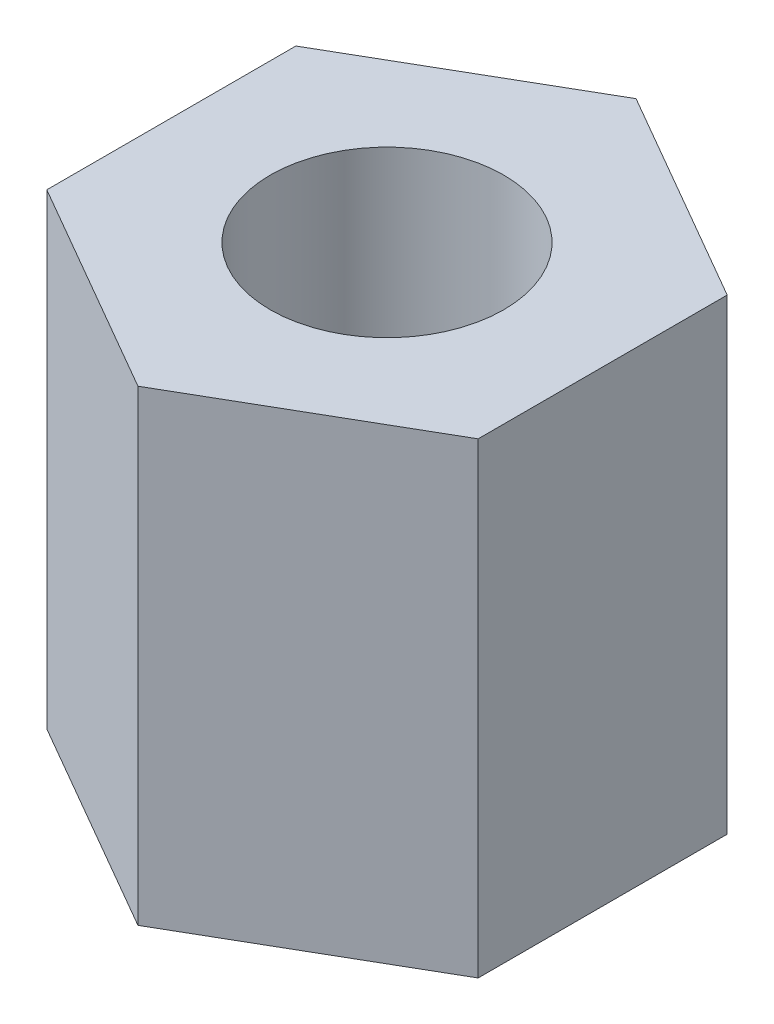
ISO-10303-21;
HEADER;
FILE_DESCRIPTION(('STEP AP214'),'2;1');
FILE_NAME('part.step','',(''),(''),'','','');
FILE_SCHEMA(('AUTOMOTIVE_DESIGN { 1 0 10303 214 1 1 1 1 }'));
ENDSEC;
DATA;
#1=APPLICATION_CONTEXT('core data for automotive mechanical design processes');
#2=APPLICATION_PROTOCOL_DEFINITION('international standard','automotive_design',2000,#1);
#3=PRODUCT_CONTEXT('',#1,'mechanical');
#4=PRODUCT('Part','Part','',(#3));
#5=PRODUCT_RELATED_PRODUCT_CATEGORY('part','',(#4));
#6=PRODUCT_DEFINITION_FORMATION('','',#4);
#7=PRODUCT_DEFINITION_CONTEXT('part definition',#1,'design');
#8=PRODUCT_DEFINITION('design','',#6,#7);
#9=PRODUCT_DEFINITION_SHAPE('','',#8);
#10=(LENGTH_UNIT() NAMED_UNIT(*) SI_UNIT(.MILLI.,.METRE.));
#11=(NAMED_UNIT(*) PLANE_ANGLE_UNIT() SI_UNIT($,.RADIAN.));
#12=(NAMED_UNIT(*) SI_UNIT($,.STERADIAN.) SOLID_ANGLE_UNIT());
#13=UNCERTAINTY_MEASURE_WITH_UNIT(LENGTH_MEASURE(1.E-05),#10,'distance_accuracy_value','');
#14=(GEOMETRIC_REPRESENTATION_CONTEXT(3) GLOBAL_UNCERTAINTY_ASSIGNED_CONTEXT((#13)) GLOBAL_UNIT_ASSIGNED_CONTEXT((#10,
#11,#12)) REPRESENTATION_CONTEXT('',''));
#15=CARTESIAN_POINT('',(0.,0.,0.));
#16=DIRECTION('',(0.,0.,1.));
#17=DIRECTION('',(1.,0.,0.));
#18=AXIS2_PLACEMENT_3D('',#15,#16,#17);
#19=CARTESIAN_POINT('',(0.,15.,0.));
#20=DIRECTION('',(0.,1.,0.));
#21=DIRECTION('',(0.,0.,1.));
#22=AXIS2_PLACEMENT_3D('',#19,#20,#21);
#23=PLANE('',#22);
#24=DIRECTION('',(-0.866025403784442,0.,-0.499999999999995));
#25=VECTOR('',#24,1.);
#26=CARTESIAN_POINT('',(6.92820323027546,15.,-4.00000000000008));
#27=LINE('',#26,#25);
#28=CARTESIAN_POINT('',(6.92820323027546,15.,-4.00000000000008));
#29=VERTEX_POINT('',#28);
#30=CARTESIAN_POINT('',(0.,15.,-8.));
#31=VERTEX_POINT('',#30);
#32=EDGE_CURVE('E134',#29,#31,#27,.T.);
#33=ORIENTED_EDGE('',*,*,#32,.T.);
#34=DIRECTION('',(-0.866025403784438,0.,0.500000000000001));
#35=VECTOR('',#34,1.);
#36=CARTESIAN_POINT('',(0.,15.,-8.));
#37=LINE('',#36,#35);
#38=CARTESIAN_POINT('',(-6.92820323027552,15.,-3.99999999999998));
#39=VERTEX_POINT('',#38);
#40=EDGE_CURVE('E92',#31,#39,#37,.T.);
#41=ORIENTED_EDGE('',*,*,#40,.T.);
#42=DIRECTION('',(0.,0.,1.));
#43=VECTOR('',#42,1.);
#44=CARTESIAN_POINT('',(-6.92820323027552,15.,-3.99999999999998));
#45=LINE('',#44,#43);
#46=CARTESIAN_POINT('',(-6.92820323027549,15.,4.00000000000003));
#47=VERTEX_POINT('',#46);
#48=EDGE_CURVE('E105',#39,#47,#45,.T.);
#49=ORIENTED_EDGE('',*,*,#48,.T.);
#50=DIRECTION('',(0.866025403784442,0.,0.499999999999995));
#51=VECTOR('',#50,1.);
#52=CARTESIAN_POINT('',(-6.92820323027549,15.,4.00000000000003));
#53=LINE('',#52,#51);
#54=CARTESIAN_POINT('',(0.,15.,8.));
#55=VERTEX_POINT('',#54);
#56=EDGE_CURVE('E99',#47,#55,#53,.T.);
#57=ORIENTED_EDGE('',*,*,#56,.T.);
#58=DIRECTION('',(0.866025403784435,0.,-0.500000000000007));
#59=VECTOR('',#58,1.);
#60=CARTESIAN_POINT('',(0.,15.,8.));
#61=LINE('',#60,#59);
#62=CARTESIAN_POINT('',(6.92820323027555,15.,3.99999999999994));
#63=VERTEX_POINT('',#62);
#64=EDGE_CURVE('E103',#55,#63,#61,.T.);
#65=ORIENTED_EDGE('',*,*,#64,.T.);
#66=DIRECTION('',(0.,0.,-1.));
#67=VECTOR('',#66,1.);
#68=CARTESIAN_POINT('',(6.92820323027555,15.,3.99999999999994));
#69=LINE('',#68,#67);
#70=EDGE_CURVE('E55',#63,#29,#69,.T.);
#71=ORIENTED_EDGE('',*,*,#70,.T.);
#72=EDGE_LOOP('',(#33,#41,#49,#57,#65,#71));
#73=FACE_BOUND('',#72,.T.);
#74=CARTESIAN_POINT('',(0.,15.,0.));
#75=DIRECTION('',(0.,1.,0.));
#76=DIRECTION('',(0.,0.,1.));
#77=AXIS2_PLACEMENT_3D('',#74,#75,#76);
#78=CIRCLE('',#77,3.75);
#79=CARTESIAN_POINT('',(0.,15.,3.75));
#80=VERTEX_POINT('',#79);
#81=EDGE_CURVE('E127',#80,#80,#78,.T.);
#82=ORIENTED_EDGE('',*,*,#81,.F.);
#83=EDGE_LOOP('',(#82));
#84=FACE_BOUND('',#83,.T.);
#85=ADVANCED_FACE('F38',(#73,#84),#23,.T.);
#86=CARTESIAN_POINT('',(0.,0.,0.));
#87=DIRECTION('',(0.,1.,0.));
#88=DIRECTION('',(0.,0.,1.));
#89=AXIS2_PLACEMENT_3D('',#86,#87,#88);
#90=PLANE('',#89);
#91=DIRECTION('',(-0.866025403784442,0.,-0.499999999999995));
#92=VECTOR('',#91,1.);
#93=CARTESIAN_POINT('',(6.92820323027546,0.,-4.00000000000008));
#94=LINE('',#93,#92);
#95=CARTESIAN_POINT('',(6.92820323027546,0.,-4.00000000000008));
#96=VERTEX_POINT('',#95);
#97=CARTESIAN_POINT('',(0.,0.,-8.));
#98=VERTEX_POINT('',#97);
#99=EDGE_CURVE('E123',#96,#98,#94,.T.);
#100=ORIENTED_EDGE('',*,*,#99,.F.);
#101=DIRECTION('',(0.,0.,-1.));
#102=VECTOR('',#101,1.);
#103=CARTESIAN_POINT('',(6.92820323027555,0.,3.99999999999994));
#104=LINE('',#103,#102);
#105=CARTESIAN_POINT('',(6.92820323027555,0.,3.99999999999994));
#106=VERTEX_POINT('',#105);
#107=EDGE_CURVE('E84',#106,#96,#104,.T.);
#108=ORIENTED_EDGE('',*,*,#107,.F.);
#109=DIRECTION('',(0.866025403784435,0.,-0.500000000000007));
#110=VECTOR('',#109,1.);
#111=CARTESIAN_POINT('',(0.,0.,8.));
#112=LINE('',#111,#110);
#113=CARTESIAN_POINT('',(0.,0.,8.));
#114=VERTEX_POINT('',#113);
#115=EDGE_CURVE('E78',#114,#106,#112,.T.);
#116=ORIENTED_EDGE('',*,*,#115,.F.);
#117=DIRECTION('',(0.866025403784442,0.,0.499999999999995));
#118=VECTOR('',#117,1.);
#119=CARTESIAN_POINT('',(-6.92820323027549,0.,4.00000000000003));
#120=LINE('',#119,#118);
#121=CARTESIAN_POINT('',(-6.92820323027549,0.,4.00000000000003));
#122=VERTEX_POINT('',#121);
#123=EDGE_CURVE('E113',#122,#114,#120,.T.);
#124=ORIENTED_EDGE('',*,*,#123,.F.);
#125=DIRECTION('',(0.,0.,1.));
#126=VECTOR('',#125,1.);
#127=CARTESIAN_POINT('',(-6.92820323027552,0.,-3.99999999999998));
#128=LINE('',#127,#126);
#129=CARTESIAN_POINT('',(-6.92820323027552,0.,-3.99999999999998));
#130=VERTEX_POINT('',#129);
#131=EDGE_CURVE('E129',#130,#122,#128,.T.);
#132=ORIENTED_EDGE('',*,*,#131,.F.);
#133=DIRECTION('',(-0.866025403784438,0.,0.500000000000001));
#134=VECTOR('',#133,1.);
#135=CARTESIAN_POINT('',(0.,0.,-8.));
#136=LINE('',#135,#134);
#137=EDGE_CURVE('E126',#98,#130,#136,.T.);
#138=ORIENTED_EDGE('',*,*,#137,.F.);
#139=EDGE_LOOP('',(#100,#108,#116,#124,#132,#138));
#140=FACE_BOUND('',#139,.T.);
#141=CARTESIAN_POINT('',(0.,0.,0.));
#142=DIRECTION('',(0.,1.,0.));
#143=DIRECTION('',(0.,0.,1.));
#144=AXIS2_PLACEMENT_3D('',#141,#142,#143);
#145=CIRCLE('',#144,3.75);
#146=CARTESIAN_POINT('',(0.,0.,3.75));
#147=VERTEX_POINT('',#146);
#148=EDGE_CURVE('E229',#147,#147,#145,.T.);
#149=ORIENTED_EDGE('',*,*,#148,.T.);
#150=EDGE_LOOP('',(#149));
#151=FACE_BOUND('',#150,.T.);
#152=ADVANCED_FACE('F143',(#140,#151),#90,.F.);
#153=CARTESIAN_POINT('',(6.92820323027546,15.,-4.00000000000008));
#154=DIRECTION('',(-0.499999999999995,0.,0.866025403784442));
#155=DIRECTION('',(0.866025403784442,0.,0.499999999999995));
#156=AXIS2_PLACEMENT_3D('',#153,#154,#155);
#157=PLANE('',#156);
#158=ORIENTED_EDGE('',*,*,#99,.T.);
#159=DIRECTION('',(0.,-1.,0.));
#160=VECTOR('',#159,1.);
#161=CARTESIAN_POINT('',(0.,15.,-8.));
#162=LINE('',#161,#160);
#163=EDGE_CURVE('E11',#31,#98,#162,.T.);
#164=ORIENTED_EDGE('',*,*,#163,.F.);
#165=ORIENTED_EDGE('',*,*,#32,.F.);
#166=DIRECTION('',(0.,-1.,0.));
#167=VECTOR('',#166,1.);
#168=CARTESIAN_POINT('',(6.92820323027546,15.,-4.00000000000008));
#169=LINE('',#168,#167);
#170=EDGE_CURVE('E119',#29,#96,#169,.T.);
#171=ORIENTED_EDGE('',*,*,#170,.T.);
#172=EDGE_LOOP('',(#158,#164,#165,#171));
#173=FACE_BOUND('',#172,.T.);
#174=ADVANCED_FACE('F40',(#173),#157,.F.);
#175=CARTESIAN_POINT('',(0.,15.,-8.));
#176=DIRECTION('',(0.500000000000001,0.,0.866025403784438));
#177=DIRECTION('',(0.866025403784438,0.,-0.500000000000001));
#178=AXIS2_PLACEMENT_3D('',#175,#176,#177);
#179=PLANE('',#178);
#180=ORIENTED_EDGE('',*,*,#137,.T.);
#181=DIRECTION('',(0.,-1.,0.));
#182=VECTOR('',#181,1.);
#183=CARTESIAN_POINT('',(-6.92820323027552,15.,-3.99999999999998));
#184=LINE('',#183,#182);
#185=EDGE_CURVE('E47',#39,#130,#184,.T.);
#186=ORIENTED_EDGE('',*,*,#185,.F.);
#187=ORIENTED_EDGE('',*,*,#40,.F.);
#188=ORIENTED_EDGE('',*,*,#163,.T.);
#189=EDGE_LOOP('',(#180,#186,#187,#188));
#190=FACE_BOUND('',#189,.T.);
#191=ADVANCED_FACE('F168',(#190),#179,.F.);
#192=CARTESIAN_POINT('',(-6.92820323027552,15.,-3.99999999999998));
#193=DIRECTION('',(1.,0.,0.));
#194=DIRECTION('',(0.,0.,-1.));
#195=AXIS2_PLACEMENT_3D('',#192,#193,#194);
#196=PLANE('',#195);
#197=ORIENTED_EDGE('',*,*,#131,.T.);
#198=DIRECTION('',(0.,-1.,0.));
#199=VECTOR('',#198,1.);
#200=CARTESIAN_POINT('',(-6.92820323027549,15.,4.00000000000003));
#201=LINE('',#200,#199);
#202=EDGE_CURVE('E114',#47,#122,#201,.T.);
#203=ORIENTED_EDGE('',*,*,#202,.F.);
#204=ORIENTED_EDGE('',*,*,#48,.F.);
#205=ORIENTED_EDGE('',*,*,#185,.T.);
#206=EDGE_LOOP('',(#197,#203,#204,#205));
#207=FACE_BOUND('',#206,.T.);
#208=ADVANCED_FACE('F140',(#207),#196,.F.);
#209=CARTESIAN_POINT('',(-6.92820323027549,15.,4.00000000000003));
#210=DIRECTION('',(0.499999999999995,0.,-0.866025403784442));
#211=DIRECTION('',(-0.866025403784442,0.,-0.499999999999995));
#212=AXIS2_PLACEMENT_3D('',#209,#210,#211);
#213=PLANE('',#212);
#214=ORIENTED_EDGE('',*,*,#123,.T.);
#215=DIRECTION('',(0.,-1.,0.));
#216=VECTOR('',#215,1.);
#217=CARTESIAN_POINT('',(0.,15.,8.));
#218=LINE('',#217,#216);
#219=EDGE_CURVE('E110',#55,#114,#218,.T.);
#220=ORIENTED_EDGE('',*,*,#219,.F.);
#221=ORIENTED_EDGE('',*,*,#56,.F.);
#222=ORIENTED_EDGE('',*,*,#202,.T.);
#223=EDGE_LOOP('',(#214,#220,#221,#222));
#224=FACE_BOUND('',#223,.T.);
#225=ADVANCED_FACE('F111',(#224),#213,.F.);
#226=CARTESIAN_POINT('',(0.,15.,8.));
#227=DIRECTION('',(-0.500000000000007,0.,-0.866025403784434));
#228=DIRECTION('',(-0.866025403784435,0.,0.500000000000007));
#229=AXIS2_PLACEMENT_3D('',#226,#227,#228);
#230=PLANE('',#229);
#231=ORIENTED_EDGE('',*,*,#115,.T.);
#232=DIRECTION('',(0.,-1.,0.));
#233=VECTOR('',#232,1.);
#234=CARTESIAN_POINT('',(6.92820323027555,15.,3.99999999999994));
#235=LINE('',#234,#233);
#236=EDGE_CURVE('E115',#63,#106,#235,.T.);
#237=ORIENTED_EDGE('',*,*,#236,.F.);
#238=ORIENTED_EDGE('',*,*,#64,.F.);
#239=ORIENTED_EDGE('',*,*,#219,.T.);
#240=EDGE_LOOP('',(#231,#237,#238,#239));
#241=FACE_BOUND('',#240,.T.);
#242=ADVANCED_FACE('F117',(#241),#230,.F.);
#243=CARTESIAN_POINT('',(6.92820323027555,15.,3.99999999999994));
#244=DIRECTION('',(-1.,0.,0.));
#245=DIRECTION('',(0.,0.,1.));
#246=AXIS2_PLACEMENT_3D('',#243,#244,#245);
#247=PLANE('',#246);
#248=ORIENTED_EDGE('',*,*,#107,.T.);
#249=ORIENTED_EDGE('',*,*,#170,.F.);
#250=ORIENTED_EDGE('',*,*,#70,.F.);
#251=ORIENTED_EDGE('',*,*,#236,.T.);
#252=EDGE_LOOP('',(#248,#249,#250,#251));
#253=FACE_BOUND('',#252,.T.);
#254=ADVANCED_FACE('F148',(#253),#247,.F.);
#255=CARTESIAN_POINT('',(0.,15.,0.));
#256=DIRECTION('',(0.,-1.,0.));
#257=DIRECTION('',(0.,0.,-1.));
#258=AXIS2_PLACEMENT_3D('',#255,#256,#257);
#259=CYLINDRICAL_SURFACE('',#258,3.75);
#260=ORIENTED_EDGE('',*,*,#81,.T.);
#261=EDGE_LOOP('',(#260));
#262=FACE_BOUND('',#261,.T.);
#263=ORIENTED_EDGE('',*,*,#148,.F.);
#264=EDGE_LOOP('',(#263));
#265=FACE_BOUND('',#264,.T.);
#266=ADVANCED_FACE('F150',(#262,#265),#259,.F.);
#267=CLOSED_SHELL('',(#85,#152,#174,#191,#208,#225,#242,#254,#266));
#268=MANIFOLD_SOLID_BREP('B2',#267);
#269=ADVANCED_BREP_SHAPE_REPRESENTATION('',(#18,#268),#14);
#270=SHAPE_DEFINITION_REPRESENTATION(#9,#269);
ENDSEC;
END-ISO-10303-21;
